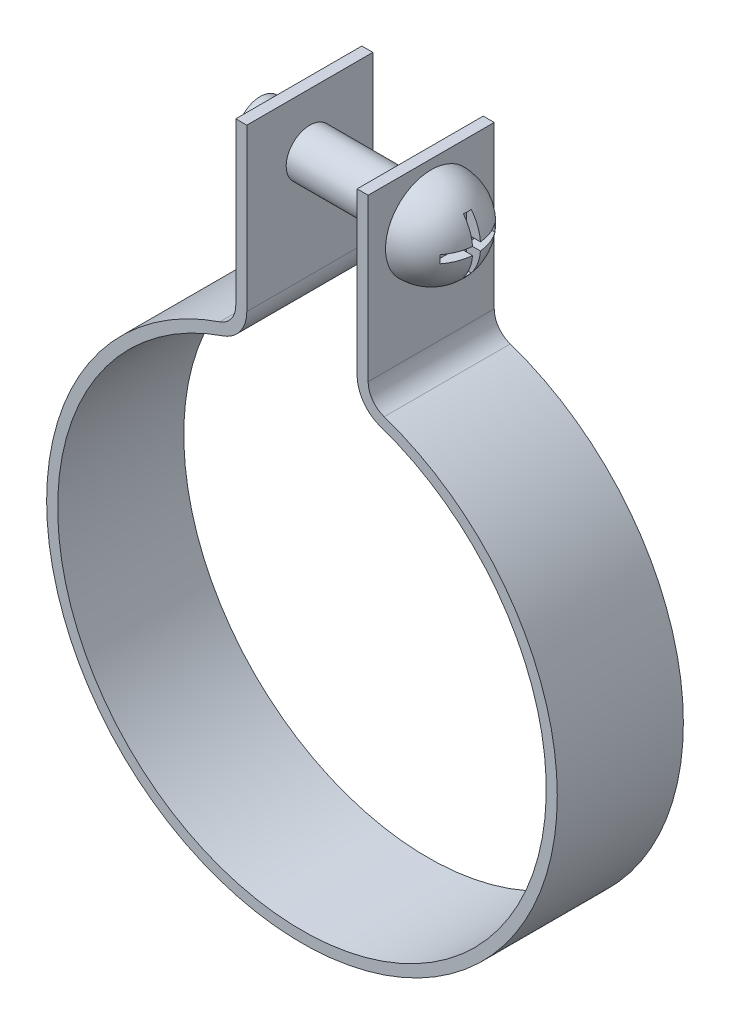
ISO-10303-21;
HEADER;
FILE_DESCRIPTION(('STEP AP214'),'2;1');
FILE_NAME('part.step','',(''),(''),'','','');
FILE_SCHEMA(('AUTOMOTIVE_DESIGN { 1 0 10303 214 1 1 1 1 }'));
ENDSEC;
DATA;
#1=APPLICATION_CONTEXT('core data for automotive mechanical design processes');
#2=APPLICATION_PROTOCOL_DEFINITION('international standard','automotive_design',2000,#1);
#3=PRODUCT_CONTEXT('',#1,'mechanical');
#4=PRODUCT('Part','Part','',(#3));
#5=PRODUCT_RELATED_PRODUCT_CATEGORY('part','',(#4));
#6=PRODUCT_DEFINITION_FORMATION('','',#4);
#7=PRODUCT_DEFINITION_CONTEXT('part definition',#1,'design');
#8=PRODUCT_DEFINITION('design','',#6,#7);
#9=PRODUCT_DEFINITION_SHAPE('','',#8);
#10=(LENGTH_UNIT() NAMED_UNIT(*) SI_UNIT(.MILLI.,.METRE.));
#11=(NAMED_UNIT(*) PLANE_ANGLE_UNIT() SI_UNIT($,.RADIAN.));
#12=(NAMED_UNIT(*) SI_UNIT($,.STERADIAN.) SOLID_ANGLE_UNIT());
#13=UNCERTAINTY_MEASURE_WITH_UNIT(LENGTH_MEASURE(1.E-05),#10,'distance_accuracy_value','');
#14=(GEOMETRIC_REPRESENTATION_CONTEXT(3) GLOBAL_UNCERTAINTY_ASSIGNED_CONTEXT((#13)) GLOBAL_UNIT_ASSIGNED_CONTEXT((#10,
#11,#12)) REPRESENTATION_CONTEXT('',''));
#15=CARTESIAN_POINT('',(0.,0.,0.));
#16=DIRECTION('',(0.,0.,1.));
#17=DIRECTION('',(1.,0.,0.));
#18=AXIS2_PLACEMENT_3D('',#15,#16,#17);
#19=CARTESIAN_POINT('',(-6.65,23.5,0.));
#20=DIRECTION('',(1.,0.,0.));
#21=DIRECTION('',(0.,1.,0.));
#22=AXIS2_PLACEMENT_3D('',#19,#20,#21);
#23=PLANE('',#22);
#24=CARTESIAN_POINT('',(-6.65,23.5,0.));
#25=DIRECTION('',(-1.,0.,0.));
#26=DIRECTION('',(0.,-1.,0.));
#27=AXIS2_PLACEMENT_3D('',#24,#25,#26);
#28=CIRCLE('',#27,1.5);
#29=CARTESIAN_POINT('',(-6.65,22.,0.));
#30=VERTEX_POINT('',#29);
#31=EDGE_CURVE('E17',#30,#30,#28,.F.);
#32=ORIENTED_EDGE('',*,*,#31,.F.);
#33=EDGE_LOOP('',(#32));
#34=FACE_BOUND('',#33,.T.);
#35=ADVANCED_FACE('F14',(#34),#23,.F.);
#36=CARTESIAN_POINT('',(7.09838316997611,23.5,0.));
#37=DIRECTION('',(-1.,0.,0.));
#38=DIRECTION('',(0.,-1.,0.));
#39=AXIS2_PLACEMENT_3D('',#36,#37,#38);
#40=CYLINDRICAL_SURFACE('',#39,1.5);
#41=ORIENTED_EDGE('',*,*,#31,.T.);
#42=EDGE_LOOP('',(#41));
#43=FACE_BOUND('',#42,.T.);
#44=CARTESIAN_POINT('',(-4.65,23.5,0.));
#45=DIRECTION('',(-1.,0.,0.));
#46=DIRECTION('',(0.,-1.,0.));
#47=AXIS2_PLACEMENT_3D('',#44,#45,#46);
#48=CIRCLE('',#47,1.5);
#49=CARTESIAN_POINT('',(-4.65,22.,0.));
#50=VERTEX_POINT('',#49);
#51=EDGE_CURVE('E512',#50,#50,#48,.T.);
#52=ORIENTED_EDGE('',*,*,#51,.T.);
#53=EDGE_LOOP('',(#52));
#54=FACE_BOUND('',#53,.T.);
#55=ADVANCED_FACE('F268',(#43,#54),#40,.T.);
#56=CARTESIAN_POINT('',(6.2,23.25,1.75));
#57=DIRECTION('',(1.,0.,0.));
#58=DIRECTION('',(0.,0.,-1.));
#59=AXIS2_PLACEMENT_3D('',#56,#57,#58);
#60=PLANE('',#59);
#61=DIRECTION('',(0.,1.,0.));
#62=VECTOR('',#61,1.);
#63=CARTESIAN_POINT('',(6.2,25.25,0.25));
#64=LINE('',#63,#62);
#65=CARTESIAN_POINT('',(6.2,23.75,0.25));
#66=VERTEX_POINT('',#65);
#67=CARTESIAN_POINT('',(6.2,25.25,0.25));
#68=VERTEX_POINT('',#67);
#69=EDGE_CURVE('E456',#66,#68,#64,.T.);
#70=ORIENTED_EDGE('',*,*,#69,.F.);
#71=DIRECTION('',(0.,0.,-1.));
#72=VECTOR('',#71,1.);
#73=CARTESIAN_POINT('',(6.2,23.75,0.25));
#74=LINE('',#73,#72);
#75=CARTESIAN_POINT('',(6.2,23.75,1.75));
#76=VERTEX_POINT('',#75);
#77=EDGE_CURVE('E462',#76,#66,#74,.T.);
#78=ORIENTED_EDGE('',*,*,#77,.F.);
#79=DIRECTION('',(0.,1.,0.));
#80=VECTOR('',#79,1.);
#81=CARTESIAN_POINT('',(6.2,23.75,1.75));
#82=LINE('',#81,#80);
#83=CARTESIAN_POINT('',(6.2,23.25,1.75));
#84=VERTEX_POINT('',#83);
#85=EDGE_CURVE('E468',#84,#76,#82,.T.);
#86=ORIENTED_EDGE('',*,*,#85,.F.);
#87=DIRECTION('',(0.,0.,1.));
#88=VECTOR('',#87,1.);
#89=CARTESIAN_POINT('',(6.2,23.25,1.75));
#90=LINE('',#89,#88);
#91=CARTESIAN_POINT('',(6.2,23.25,0.25));
#92=VERTEX_POINT('',#91);
#93=EDGE_CURVE('E474',#92,#84,#90,.T.);
#94=ORIENTED_EDGE('',*,*,#93,.F.);
#95=DIRECTION('',(0.,1.,0.));
#96=VECTOR('',#95,1.);
#97=CARTESIAN_POINT('',(6.2,23.25,0.25));
#98=LINE('',#97,#96);
#99=CARTESIAN_POINT('',(6.2,21.75,0.25));
#100=VERTEX_POINT('',#99);
#101=EDGE_CURVE('E480',#100,#92,#98,.T.);
#102=ORIENTED_EDGE('',*,*,#101,.F.);
#103=DIRECTION('',(0.,0.,1.));
#104=VECTOR('',#103,1.);
#105=CARTESIAN_POINT('',(6.2,21.75,0.25));
#106=LINE('',#105,#104);
#107=CARTESIAN_POINT('',(6.2,21.75,-0.25));
#108=VERTEX_POINT('',#107);
#109=EDGE_CURVE('E204',#108,#100,#106,.T.);
#110=ORIENTED_EDGE('',*,*,#109,.F.);
#111=DIRECTION('',(0.,-1.,0.));
#112=VECTOR('',#111,1.);
#113=CARTESIAN_POINT('',(6.2,21.75,-0.25));
#114=LINE('',#113,#112);
#115=CARTESIAN_POINT('',(6.2,23.25,-0.25));
#116=VERTEX_POINT('',#115);
#117=EDGE_CURVE('E202',#116,#108,#114,.T.);
#118=ORIENTED_EDGE('',*,*,#117,.F.);
#119=DIRECTION('',(0.,0.,1.));
#120=VECTOR('',#119,1.);
#121=CARTESIAN_POINT('',(6.2,23.25,-0.25));
#122=LINE('',#121,#120);
#123=CARTESIAN_POINT('',(6.2,23.25,-1.75));
#124=VERTEX_POINT('',#123);
#125=EDGE_CURVE('E490',#124,#116,#122,.T.);
#126=ORIENTED_EDGE('',*,*,#125,.F.);
#127=DIRECTION('',(0.,1.,0.));
#128=VECTOR('',#127,1.);
#129=CARTESIAN_POINT('',(6.2,23.25,-1.75));
#130=LINE('',#129,#128);
#131=CARTESIAN_POINT('',(6.2,23.75,-1.75));
#132=VERTEX_POINT('',#131);
#133=EDGE_CURVE('E496',#132,#124,#130,.F.);
#134=ORIENTED_EDGE('',*,*,#133,.F.);
#135=DIRECTION('',(0.,0.,1.));
#136=VECTOR('',#135,1.);
#137=CARTESIAN_POINT('',(6.2,23.75,-1.75));
#138=LINE('',#137,#136);
#139=CARTESIAN_POINT('',(6.2,23.75,-0.25));
#140=VERTEX_POINT('',#139);
#141=EDGE_CURVE('E502',#140,#132,#138,.F.);
#142=ORIENTED_EDGE('',*,*,#141,.F.);
#143=DIRECTION('',(0.,-1.,0.));
#144=VECTOR('',#143,1.);
#145=CARTESIAN_POINT('',(6.2,23.75,-0.25));
#146=LINE('',#145,#144);
#147=CARTESIAN_POINT('',(6.2,25.25,-0.25));
#148=VERTEX_POINT('',#147);
#149=EDGE_CURVE('E508',#148,#140,#146,.T.);
#150=ORIENTED_EDGE('',*,*,#149,.F.);
#151=DIRECTION('',(0.,0.,-1.));
#152=VECTOR('',#151,1.);
#153=CARTESIAN_POINT('',(6.2,25.25,1.75));
#154=LINE('',#153,#152);
#155=EDGE_CURVE('E519',#148,#68,#154,.F.);
#156=ORIENTED_EDGE('',*,*,#155,.T.);
#157=EDGE_LOOP('',(#70,#78,#86,#94,#102,#110,#118,#126,#134,#142,#150,#156));
#158=FACE_BOUND('',#157,.T.);
#159=ADVANCED_FACE('F265',(#158),#60,.T.);
#160=CARTESIAN_POINT('',(-4.65,25.,0.));
#161=DIRECTION('',(1.,0.,0.));
#162=DIRECTION('',(0.,1.,0.));
#163=AXIS2_PLACEMENT_3D('',#160,#161,#162);
#164=PLANE('',#163);
#165=CARTESIAN_POINT('',(-4.65,23.5,0.));
#166=DIRECTION('',(-1.,0.,0.));
#167=DIRECTION('',(0.,-1.,0.));
#168=AXIS2_PLACEMENT_3D('',#165,#166,#167);
#169=CIRCLE('',#168,2.);
#170=CARTESIAN_POINT('',(-4.65,21.5,0.));
#171=VERTEX_POINT('',#170);
#172=EDGE_CURVE('E256',#171,#171,#169,.F.);
#173=ORIENTED_EDGE('',*,*,#172,.F.);
#174=EDGE_LOOP('',(#173));
#175=FACE_BOUND('',#174,.T.);
#176=ORIENTED_EDGE('',*,*,#51,.F.);
#177=EDGE_LOOP('',(#176));
#178=FACE_BOUND('',#177,.T.);
#179=ADVANCED_FACE('F261',(#175,#178),#164,.F.);
#180=CARTESIAN_POINT('',(16.2,23.75,-0.25));
#181=DIRECTION('',(0.,0.,1.));
#182=DIRECTION('',(0.,-1.,0.));
#183=AXIS2_PLACEMENT_3D('',#180,#181,#182);
#184=PLANE('',#183);
#185=ORIENTED_EDGE('',*,*,#149,.T.);
#186=DIRECTION('',(1.,0.,0.));
#187=VECTOR('',#186,1.);
#188=CARTESIAN_POINT('',(16.2,23.75,-0.25));
#189=LINE('',#188,#187);
#190=CARTESIAN_POINT('',(7.07673860473988,23.75,-0.25));
#191=VERTEX_POINT('',#190);
#192=EDGE_CURVE('E505',#191,#140,#189,.F.);
#193=ORIENTED_EDGE('',*,*,#192,.F.);
#194=CARTESIAN_POINT('',(6.49687287414885,25.25,-0.25));
#195=CARTESIAN_POINT('',(6.54665375463442,25.1846773678993,-0.25));
#196=CARTESIAN_POINT('',(6.59363284839111,25.1172215093846,-0.25));
#197=CARTESIAN_POINT('',(6.68168682515345,24.9785430288544,-0.25));
#198=CARTESIAN_POINT('',(6.72276063640672,24.9073197262843,-0.25));
#199=CARTESIAN_POINT('',(6.79780589258358,24.7633172653865,-0.25));
#200=CARTESIAN_POINT('',(6.8319198026339,24.690612349176,-0.250000000000001));
#201=CARTESIAN_POINT('',(6.89396672840313,24.5426437169833,-0.249999999999999));
#202=CARTESIAN_POINT('',(6.9219016093801,24.4673807811246,-0.249999999999996));
#203=CARTESIAN_POINT('',(6.98009469113532,24.2879880733263,-0.250000000000006));
#204=CARTESIAN_POINT('',(7.00772853149205,24.1829960716417,-0.250000000000025));
#205=CARTESIAN_POINT('',(7.05139681078929,23.9688741603984,-0.249999999999975));
#206=CARTESIAN_POINT('',(7.06723845095502,23.85970491392,-0.249999999999906));
#207=CARTESIAN_POINT('',(7.07673860473984,23.7500000000007,-0.249999999999732));
#208=B_SPLINE_CURVE_WITH_KNOTS('',3,(#194,#195,#196,#197,#198,#199,#200,#201,#202,#203,#204,
#205,#206,#207),.UNSPECIFIED.,.F.,.F.,(4,2,2,2,2,2,4),(0.,0.246310540780081,0.492665728292477,
0.733315058497538,0.973891644659722,1.29888612081365,1.62908399931379),.UNSPECIFIED.);
#209=CARTESIAN_POINT('',(6.49687287414885,25.25,-0.25));
#210=VERTEX_POINT('',#209);
#211=EDGE_CURVE('E250',#210,#191,#208,.T.);
#212=ORIENTED_EDGE('',*,*,#211,.F.);
#213=DIRECTION('',(1.,0.,0.));
#214=VECTOR('',#213,1.);
#215=CARTESIAN_POINT('',(16.2,25.25,-0.25));
#216=LINE('',#215,#214);
#217=EDGE_CURVE('E449',#148,#210,#216,.T.);
#218=ORIENTED_EDGE('',*,*,#217,.F.);
#219=EDGE_LOOP('',(#185,#193,#212,#218));
#220=FACE_BOUND('',#219,.T.);
#221=ADVANCED_FACE('F257',(#220),#184,.T.);
#222=CARTESIAN_POINT('',(16.2,23.75,-1.75));
#223=DIRECTION('',(0.,-1.,0.));
#224=DIRECTION('',(1.,0.,0.));
#225=AXIS2_PLACEMENT_3D('',#222,#223,#224);
#226=PLANE('',#225);
#227=ORIENTED_EDGE('',*,*,#141,.T.);
#228=DIRECTION('',(1.,0.,0.));
#229=VECTOR('',#228,1.);
#230=CARTESIAN_POINT('',(16.2,23.75,-1.75));
#231=LINE('',#230,#229);
#232=CARTESIAN_POINT('',(6.49687287414884,23.75,-1.75));
#233=VERTEX_POINT('',#232);
#234=EDGE_CURVE('E499',#233,#132,#231,.F.);
#235=ORIENTED_EDGE('',*,*,#234,.F.);
#236=CARTESIAN_POINT('',(4.2,23.75,0.));
#237=DIRECTION('',(0.,1.,0.));
#238=DIRECTION('',(-1.,0.,0.));
#239=AXIS2_PLACEMENT_3D('',#236,#237,#238);
#240=CIRCLE('',#239,2.88758116769049);
#241=EDGE_CURVE('E247',#191,#233,#240,.T.);
#242=ORIENTED_EDGE('',*,*,#241,.F.);
#243=ORIENTED_EDGE('',*,*,#192,.T.);
#244=EDGE_LOOP('',(#227,#235,#242,#243));
#245=FACE_BOUND('',#244,.T.);
#246=ADVANCED_FACE('F239',(#245),#226,.T.);
#247=CARTESIAN_POINT('',(16.2,23.25,-1.75));
#248=DIRECTION('',(0.,0.,1.));
#249=DIRECTION('',(1.,0.,0.));
#250=AXIS2_PLACEMENT_3D('',#247,#248,#249);
#251=PLANE('',#250);
#252=ORIENTED_EDGE('',*,*,#133,.T.);
#253=DIRECTION('',(-1.,0.,0.));
#254=VECTOR('',#253,1.);
#255=CARTESIAN_POINT('',(16.2,23.25,-1.75));
#256=LINE('',#255,#254);
#257=CARTESIAN_POINT('',(6.49687287414884,23.25,-1.75));
#258=VERTEX_POINT('',#257);
#259=EDGE_CURVE('E493',#258,#124,#256,.T.);
#260=ORIENTED_EDGE('',*,*,#259,.F.);
#261=CARTESIAN_POINT('',(6.49687287414884,23.75,-1.75));
#262=CARTESIAN_POINT('',(6.5059164714693,23.6666666666667,-1.75));
#263=CARTESIAN_POINT('',(6.51043827012952,23.5833333333333,-1.75));
#264=CARTESIAN_POINT('',(6.51043827012952,23.4166666666667,-1.75));
#265=CARTESIAN_POINT('',(6.5059164714693,23.3333333333333,-1.75));
#266=CARTESIAN_POINT('',(6.49687287414884,23.25,-1.75));
#267=B_SPLINE_CURVE_WITH_KNOTS('',3,(#261,#262,#263,#264,#265,#266),.UNSPECIFIED.,.F.,.F.,(4,2,
4),(0.,0.250367769427525,0.500735538855047),.UNSPECIFIED.);
#268=EDGE_CURVE('E212',#233,#258,#267,.T.);
#269=ORIENTED_EDGE('',*,*,#268,.F.);
#270=ORIENTED_EDGE('',*,*,#234,.T.);
#271=EDGE_LOOP('',(#252,#260,#269,#270));
#272=FACE_BOUND('',#271,.T.);
#273=ADVANCED_FACE('F234',(#272),#251,.T.);
#274=CARTESIAN_POINT('',(16.2,23.25,-0.25));
#275=DIRECTION('',(0.,1.,0.));
#276=DIRECTION('',(-1.,0.,0.));
#277=AXIS2_PLACEMENT_3D('',#274,#275,#276);
#278=PLANE('',#277);
#279=ORIENTED_EDGE('',*,*,#125,.T.);
#280=DIRECTION('',(1.,0.,0.));
#281=VECTOR('',#280,1.);
#282=CARTESIAN_POINT('',(16.2,23.25,-0.25));
#283=LINE('',#282,#281);
#284=CARTESIAN_POINT('',(7.07673860473988,23.25,-0.25));
#285=VERTEX_POINT('',#284);
#286=EDGE_CURVE('E488',#285,#116,#283,.F.);
#287=ORIENTED_EDGE('',*,*,#286,.F.);
#288=CARTESIAN_POINT('',(4.2,23.25,0.));
#289=DIRECTION('',(0.,1.,0.));
#290=DIRECTION('',(-1.,0.,0.));
#291=AXIS2_PLACEMENT_3D('',#288,#289,#290);
#292=CIRCLE('',#291,2.88758116769049);
#293=EDGE_CURVE('E210',#258,#285,#292,.F.);
#294=ORIENTED_EDGE('',*,*,#293,.F.);
#295=ORIENTED_EDGE('',*,*,#259,.T.);
#296=EDGE_LOOP('',(#279,#287,#294,#295));
#297=FACE_BOUND('',#296,.T.);
#298=ADVANCED_FACE('F230',(#297),#278,.T.);
#299=CARTESIAN_POINT('',(16.2,21.75,-0.25));
#300=DIRECTION('',(0.,0.,1.));
#301=DIRECTION('',(0.,-1.,0.));
#302=AXIS2_PLACEMENT_3D('',#299,#300,#301);
#303=PLANE('',#302);
#304=ORIENTED_EDGE('',*,*,#117,.T.);
#305=DIRECTION('',(-1.,0.,0.));
#306=VECTOR('',#305,1.);
#307=CARTESIAN_POINT('',(16.2,21.75,-0.25));
#308=LINE('',#307,#306);
#309=CARTESIAN_POINT('',(6.49687287414885,21.75,-0.25));
#310=VERTEX_POINT('',#309);
#311=EDGE_CURVE('E187',#310,#108,#308,.T.);
#312=ORIENTED_EDGE('',*,*,#311,.F.);
#313=CARTESIAN_POINT('',(7.07673860473988,23.25,-0.25));
#314=CARTESIAN_POINT('',(7.06963694689979,23.1681785554857,-0.25));
#315=CARTESIAN_POINT('',(7.05902715557849,23.0866631555525,-0.25));
#316=CARTESIAN_POINT('',(7.03090495022989,22.9248164214113,-0.25));
#317=CARTESIAN_POINT('',(7.01339128536824,22.8444853045078,-0.25));
#318=CARTESIAN_POINT('',(6.9720618608212,22.687449073383,-0.25));
#319=CARTESIAN_POINT('',(6.94840145955926,22.6107030694985,-0.25));
#320=CARTESIAN_POINT('',(6.89478581354943,22.4594750971742,-0.25));
#321=CARTESIAN_POINT('',(6.86483247378351,22.384992451369,-0.25));
#322=CARTESIAN_POINT('',(6.78722816182028,22.2131036816948,-0.25));
#323=CARTESIAN_POINT('',(6.73705526339339,22.1168247649266,-0.25));
#324=CARTESIAN_POINT('',(6.62534290140629,21.9290071414972,-0.25));
#325=CARTESIAN_POINT('',(6.56363431222961,21.8375690096175,-0.25));
#326=CARTESIAN_POINT('',(6.49687287414885,21.75,-0.25));
#327=B_SPLINE_CURVE_WITH_KNOTS('',3,(#313,#314,#315,#316,#317,#318,#319,#320,#321,#322,#323,
#324,#325,#326),.UNSPECIFIED.,.F.,.F.,(4,2,2,2,2,2,4),(0.,0.246310540780083,0.492665728292481,
0.733315058497539,0.973891644659718,1.298886120814,1.6290839993145),.UNSPECIFIED.);
#328=EDGE_CURVE('E194',#285,#310,#327,.T.);
#329=ORIENTED_EDGE('',*,*,#328,.F.);
#330=ORIENTED_EDGE('',*,*,#286,.T.);
#331=EDGE_LOOP('',(#304,#312,#329,#330));
#332=FACE_BOUND('',#331,.T.);
#333=ADVANCED_FACE('F198',(#332),#303,.T.);
#334=CARTESIAN_POINT('',(16.2,21.75,0.25));
#335=DIRECTION('',(0.,1.,0.));
#336=DIRECTION('',(-1.,0.,0.));
#337=AXIS2_PLACEMENT_3D('',#334,#335,#336);
#338=PLANE('',#337);
#339=ORIENTED_EDGE('',*,*,#109,.T.);
#340=DIRECTION('',(1.,0.,0.));
#341=VECTOR('',#340,1.);
#342=CARTESIAN_POINT('',(16.2,21.75,0.25));
#343=LINE('',#342,#341);
#344=CARTESIAN_POINT('',(6.49687287414885,21.75,0.25));
#345=VERTEX_POINT('',#344);
#346=EDGE_CURVE('E189',#345,#100,#343,.F.);
#347=ORIENTED_EDGE('',*,*,#346,.F.);
#348=CARTESIAN_POINT('',(4.2,21.75,0.));
#349=DIRECTION('',(0.,1.,0.));
#350=DIRECTION('',(-1.,0.,0.));
#351=AXIS2_PLACEMENT_3D('',#348,#349,#350);
#352=CIRCLE('',#351,2.31043827011257);
#353=EDGE_CURVE('E184',#310,#345,#352,.F.);
#354=ORIENTED_EDGE('',*,*,#353,.F.);
#355=ORIENTED_EDGE('',*,*,#311,.T.);
#356=EDGE_LOOP('',(#339,#347,#354,#355));
#357=FACE_BOUND('',#356,.T.);
#358=ADVANCED_FACE('F186',(#357),#338,.T.);
#359=CARTESIAN_POINT('',(16.2,23.25,0.25));
#360=DIRECTION('',(0.,0.,-1.));
#361=DIRECTION('',(0.,1.,0.));
#362=AXIS2_PLACEMENT_3D('',#359,#360,#361);
#363=PLANE('',#362);
#364=ORIENTED_EDGE('',*,*,#101,.T.);
#365=DIRECTION('',(-1.,0.,0.));
#366=VECTOR('',#365,1.);
#367=CARTESIAN_POINT('',(16.2,23.25,0.25));
#368=LINE('',#367,#366);
#369=CARTESIAN_POINT('',(7.07673860473988,23.25,0.25));
#370=VERTEX_POINT('',#369);
#371=EDGE_CURVE('E477',#370,#92,#368,.T.);
#372=ORIENTED_EDGE('',*,*,#371,.F.);
#373=CARTESIAN_POINT('',(6.49687287414885,21.75,0.250000000000001));
#374=CARTESIAN_POINT('',(6.54665375463442,21.8153226321007,0.250000000000001));
#375=CARTESIAN_POINT('',(6.59363284839112,21.8827784906154,0.25));
#376=CARTESIAN_POINT('',(6.68168682515345,22.0214569711456,0.25));
#377=CARTESIAN_POINT('',(6.72276063640672,22.0926802737157,0.25));
#378=CARTESIAN_POINT('',(6.79780589258358,22.2366827346135,0.25));
#379=CARTESIAN_POINT('',(6.8319198026339,22.309387650824,0.250000000000001));
#380=CARTESIAN_POINT('',(6.89396672840313,22.4573562830167,0.249999999999999));
#381=CARTESIAN_POINT('',(6.9219016093801,22.5326192188754,0.249999999999995));
#382=CARTESIAN_POINT('',(6.98009469113532,22.7120119266737,0.250000000000005));
#383=CARTESIAN_POINT('',(7.00772853149205,22.8170039283583,0.250000000000024));
#384=CARTESIAN_POINT('',(7.05139681078929,23.0311258396016,0.249999999999976));
#385=CARTESIAN_POINT('',(7.06723845095502,23.14029508608,0.249999999999907));
#386=CARTESIAN_POINT('',(7.07673860473984,23.2499999999993,0.249999999999733));
#387=B_SPLINE_CURVE_WITH_KNOTS('',3,(#373,#374,#375,#376,#377,#378,#379,#380,#381,#382,#383,
#384,#385,#386),.UNSPECIFIED.,.F.,.F.,(4,2,2,2,2,2,4),(0.,0.246310540780082,0.492665728292477,
0.733315058497538,0.973891644659722,1.29888612081365,1.62908399931379),.UNSPECIFIED.);
#388=EDGE_CURVE('E193',#345,#370,#387,.T.);
#389=ORIENTED_EDGE('',*,*,#388,.F.);
#390=ORIENTED_EDGE('',*,*,#346,.T.);
#391=EDGE_LOOP('',(#364,#372,#389,#390));
#392=FACE_BOUND('',#391,.T.);
#393=ADVANCED_FACE('F615',(#392),#363,.T.);
#394=CARTESIAN_POINT('',(16.2,23.25,1.75));
#395=DIRECTION('',(0.,1.,0.));
#396=DIRECTION('',(-1.,0.,0.));
#397=AXIS2_PLACEMENT_3D('',#394,#395,#396);
#398=PLANE('',#397);
#399=ORIENTED_EDGE('',*,*,#93,.T.);
#400=DIRECTION('',(-1.,0.,0.));
#401=VECTOR('',#400,1.);
#402=CARTESIAN_POINT('',(16.2,23.25,1.75));
#403=LINE('',#402,#401);
#404=CARTESIAN_POINT('',(6.49687287414884,23.25,1.75));
#405=VERTEX_POINT('',#404);
#406=EDGE_CURVE('E471',#405,#84,#403,.T.);
#407=ORIENTED_EDGE('',*,*,#406,.F.);
#408=CARTESIAN_POINT('',(4.2,23.25,0.));
#409=DIRECTION('',(0.,1.,0.));
#410=DIRECTION('',(-1.,0.,0.));
#411=AXIS2_PLACEMENT_3D('',#408,#409,#410);
#412=CIRCLE('',#411,2.88758116769049);
#413=EDGE_CURVE('E609',#370,#405,#412,.F.);
#414=ORIENTED_EDGE('',*,*,#413,.F.);
#415=ORIENTED_EDGE('',*,*,#371,.T.);
#416=EDGE_LOOP('',(#399,#407,#414,#415));
#417=FACE_BOUND('',#416,.T.);
#418=ADVANCED_FACE('F600',(#417),#398,.T.);
#419=CARTESIAN_POINT('',(16.2,23.75,1.75));
#420=DIRECTION('',(0.,0.,-1.));
#421=DIRECTION('',(-1.,0.,0.));
#422=AXIS2_PLACEMENT_3D('',#419,#420,#421);
#423=PLANE('',#422);
#424=ORIENTED_EDGE('',*,*,#85,.T.);
#425=DIRECTION('',(1.,0.,0.));
#426=VECTOR('',#425,1.);
#427=CARTESIAN_POINT('',(16.2,23.75,1.75));
#428=LINE('',#427,#426);
#429=CARTESIAN_POINT('',(6.49687287414884,23.75,1.75));
#430=VERTEX_POINT('',#429);
#431=EDGE_CURVE('E465',#430,#76,#428,.F.);
#432=ORIENTED_EDGE('',*,*,#431,.F.);
#433=CARTESIAN_POINT('',(6.49687287414884,23.25,1.75));
#434=CARTESIAN_POINT('',(6.5059164714693,23.3333333333333,1.75));
#435=CARTESIAN_POINT('',(6.51043827012952,23.4166666666667,1.75));
#436=CARTESIAN_POINT('',(6.51043827012952,23.5833333333333,1.75));
#437=CARTESIAN_POINT('',(6.5059164714693,23.6666666666667,1.75));
#438=CARTESIAN_POINT('',(6.49687287414884,23.75,1.75));
#439=B_SPLINE_CURVE_WITH_KNOTS('',3,(#433,#434,#435,#436,#437,#438),.UNSPECIFIED.,.F.,.F.,(4,2,
4),(0.,0.250367769427525,0.500735538855047),.UNSPECIFIED.);
#440=EDGE_CURVE('E602',#405,#430,#439,.T.);
#441=ORIENTED_EDGE('',*,*,#440,.F.);
#442=ORIENTED_EDGE('',*,*,#406,.T.);
#443=EDGE_LOOP('',(#424,#432,#441,#442));
#444=FACE_BOUND('',#443,.T.);
#445=ADVANCED_FACE('F595',(#444),#423,.T.);
#446=CARTESIAN_POINT('',(16.2,23.75,0.25));
#447=DIRECTION('',(0.,-1.,0.));
#448=DIRECTION('',(0.,0.,-1.));
#449=AXIS2_PLACEMENT_3D('',#446,#447,#448);
#450=PLANE('',#449);
#451=ORIENTED_EDGE('',*,*,#77,.T.);
#452=DIRECTION('',(-1.,0.,0.));
#453=VECTOR('',#452,1.);
#454=CARTESIAN_POINT('',(16.2,23.75,0.25));
#455=LINE('',#454,#453);
#456=CARTESIAN_POINT('',(7.07673860473988,23.75,0.25));
#457=VERTEX_POINT('',#456);
#458=EDGE_CURVE('E459',#457,#66,#455,.T.);
#459=ORIENTED_EDGE('',*,*,#458,.F.);
#460=CARTESIAN_POINT('',(4.2,23.75,0.));
#461=DIRECTION('',(0.,1.,0.));
#462=DIRECTION('',(-1.,0.,0.));
#463=AXIS2_PLACEMENT_3D('',#460,#461,#462);
#464=CIRCLE('',#463,2.88758116769049);
#465=EDGE_CURVE('E582',#430,#457,#464,.T.);
#466=ORIENTED_EDGE('',*,*,#465,.F.);
#467=ORIENTED_EDGE('',*,*,#431,.T.);
#468=EDGE_LOOP('',(#451,#459,#466,#467));
#469=FACE_BOUND('',#468,.T.);
#470=ADVANCED_FACE('F590',(#469),#450,.T.);
#471=CARTESIAN_POINT('',(16.2,25.25,0.25));
#472=DIRECTION('',(0.,0.,-1.));
#473=DIRECTION('',(-1.,0.,0.));
#474=AXIS2_PLACEMENT_3D('',#471,#472,#473);
#475=PLANE('',#474);
#476=ORIENTED_EDGE('',*,*,#69,.T.);
#477=DIRECTION('',(1.,0.,0.));
#478=VECTOR('',#477,1.);
#479=CARTESIAN_POINT('',(16.2,25.25,0.25));
#480=LINE('',#479,#478);
#481=CARTESIAN_POINT('',(6.49687287414885,25.25,0.25));
#482=VERTEX_POINT('',#481);
#483=EDGE_CURVE('E451',#482,#68,#480,.F.);
#484=ORIENTED_EDGE('',*,*,#483,.F.);
#485=CARTESIAN_POINT('',(7.07673860473988,23.75,0.249999999999998));
#486=CARTESIAN_POINT('',(7.06963694689979,23.8318214445143,0.249999999999999));
#487=CARTESIAN_POINT('',(7.05902715557849,23.9133368444475,0.25));
#488=CARTESIAN_POINT('',(7.03090495022989,24.0751835785887,0.25));
#489=CARTESIAN_POINT('',(7.01339128536824,24.1555146954922,0.25));
#490=CARTESIAN_POINT('',(6.9720618608212,24.312550926617,0.25));
#491=CARTESIAN_POINT('',(6.94840145955926,24.3892969305015,0.25));
#492=CARTESIAN_POINT('',(6.89478581354943,24.5405249028258,0.25));
#493=CARTESIAN_POINT('',(6.86483247378351,24.615007548631,0.25));
#494=CARTESIAN_POINT('',(6.78722816182028,24.7868963183052,0.250000000000001));
#495=CARTESIAN_POINT('',(6.73705526339339,24.8831752350734,0.25));
#496=CARTESIAN_POINT('',(6.62534290140629,25.0709928585028,0.25));
#497=CARTESIAN_POINT('',(6.56363431222961,25.1624309903825,0.249999999999999));
#498=CARTESIAN_POINT('',(6.49687287414885,25.25,0.249999999999999));
#499=B_SPLINE_CURVE_WITH_KNOTS('',3,(#485,#486,#487,#488,#489,#490,#491,#492,#493,#494,#495,
#496,#497,#498),.UNSPECIFIED.,.F.,.F.,(4,2,2,2,2,2,4),(0.,0.24631054078008,0.492665728292481,
0.733315058497539,0.973891644659718,1.298886120814,1.6290839993145),.UNSPECIFIED.);
#500=EDGE_CURVE('E575',#457,#482,#499,.T.);
#501=ORIENTED_EDGE('',*,*,#500,.F.);
#502=ORIENTED_EDGE('',*,*,#458,.T.);
#503=EDGE_LOOP('',(#476,#484,#501,#502));
#504=FACE_BOUND('',#503,.T.);
#505=ADVANCED_FACE('F584',(#504),#475,.T.);
#506=CARTESIAN_POINT('',(16.2,25.25,-0.25));
#507=DIRECTION('',(0.,-1.,0.));
#508=DIRECTION('',(1.,0.,0.));
#509=AXIS2_PLACEMENT_3D('',#506,#507,#508);
#510=PLANE('',#509);
#511=ORIENTED_EDGE('',*,*,#155,.F.);
#512=ORIENTED_EDGE('',*,*,#217,.T.);
#513=CARTESIAN_POINT('',(4.2,25.25,0.));
#514=DIRECTION('',(0.,1.,0.));
#515=DIRECTION('',(-1.,0.,0.));
#516=AXIS2_PLACEMENT_3D('',#513,#514,#515);
#517=CIRCLE('',#516,2.31043827011258);
#518=EDGE_CURVE('E178',#482,#210,#517,.T.);
#519=ORIENTED_EDGE('',*,*,#518,.F.);
#520=ORIENTED_EDGE('',*,*,#483,.T.);
#521=EDGE_LOOP('',(#511,#512,#519,#520));
#522=FACE_BOUND('',#521,.T.);
#523=ADVANCED_FACE('F589',(#522),#510,.T.);
#524=CARTESIAN_POINT('',(7.09838316997611,23.5,0.));
#525=DIRECTION('',(-1.,0.,0.));
#526=DIRECTION('',(0.,-1.,0.));
#527=AXIS2_PLACEMENT_3D('',#524,#525,#526);
#528=CYLINDRICAL_SURFACE('',#527,2.);
#529=ORIENTED_EDGE('',*,*,#172,.T.);
#530=EDGE_LOOP('',(#529));
#531=FACE_BOUND('',#530,.T.);
#532=CARTESIAN_POINT('',(-4.2,23.5,0.));
#533=DIRECTION('',(-1.,0.,0.));
#534=DIRECTION('',(0.,-1.,0.));
#535=AXIS2_PLACEMENT_3D('',#532,#533,#534);
#536=CIRCLE('',#535,2.);
#537=CARTESIAN_POINT('',(-4.2,21.5,0.));
#538=VERTEX_POINT('',#537);
#539=EDGE_CURVE('E419',#538,#538,#536,.T.);
#540=ORIENTED_EDGE('',*,*,#539,.T.);
#541=EDGE_LOOP('',(#540));
#542=FACE_BOUND('',#541,.T.);
#543=ADVANCED_FACE('F707',(#531,#542),#528,.T.);
#544=CARTESIAN_POINT('',(-3.5,27.,4.));
#545=DIRECTION('',(0.,-1.,0.));
#546=DIRECTION('',(0.,0.,-1.));
#547=AXIS2_PLACEMENT_3D('',#544,#545,#546);
#548=PLANE('',#547);
#549=DIRECTION('',(1.,0.,0.));
#550=VECTOR('',#549,1.);
#551=CARTESIAN_POINT('',(-3.5,27.,-4.));
#552=LINE('',#551,#550);
#553=CARTESIAN_POINT('',(-4.2,27.,-4.));
#554=VERTEX_POINT('',#553);
#555=CARTESIAN_POINT('',(-3.5,27.,-4.));
#556=VERTEX_POINT('',#555);
#557=EDGE_CURVE('E436',#554,#556,#552,.T.);
#558=ORIENTED_EDGE('',*,*,#557,.F.);
#559=DIRECTION('',(0.,0.,1.));
#560=VECTOR('',#559,1.);
#561=CARTESIAN_POINT('',(-4.2,27.,4.));
#562=LINE('',#561,#560);
#563=CARTESIAN_POINT('',(-4.2,27.,4.));
#564=VERTEX_POINT('',#563);
#565=EDGE_CURVE('E424',#554,#564,#562,.T.);
#566=ORIENTED_EDGE('',*,*,#565,.T.);
#567=DIRECTION('',(1.,0.,0.));
#568=VECTOR('',#567,1.);
#569=CARTESIAN_POINT('',(-3.5,27.,4.));
#570=LINE('',#569,#568);
#571=CARTESIAN_POINT('',(-3.5,27.,4.));
#572=VERTEX_POINT('',#571);
#573=EDGE_CURVE('E442',#572,#564,#570,.F.);
#574=ORIENTED_EDGE('',*,*,#573,.F.);
#575=DIRECTION('',(0.,0.,1.));
#576=VECTOR('',#575,1.);
#577=CARTESIAN_POINT('',(-3.5,27.,4.));
#578=LINE('',#577,#576);
#579=EDGE_CURVE('E416',#572,#556,#578,.F.);
#580=ORIENTED_EDGE('',*,*,#579,.T.);
#581=EDGE_LOOP('',(#558,#566,#574,#580));
#582=FACE_BOUND('',#581,.T.);
#583=ADVANCED_FACE('F715',(#582),#548,.F.);
#584=CARTESIAN_POINT('',(7.09838316997611,23.5,0.));
#585=DIRECTION('',(-1.,0.,0.));
#586=DIRECTION('',(0.,-1.,0.));
#587=AXIS2_PLACEMENT_3D('',#584,#585,#586);
#588=CYLINDRICAL_SURFACE('',#587,1.5);
#589=CARTESIAN_POINT('',(-3.5,23.5,0.));
#590=DIRECTION('',(-1.,0.,0.));
#591=DIRECTION('',(0.,-1.,0.));
#592=AXIS2_PLACEMENT_3D('',#589,#590,#591);
#593=CIRCLE('',#592,1.5);
#594=CARTESIAN_POINT('',(-3.5,22.,0.));
#595=VERTEX_POINT('',#594);
#596=EDGE_CURVE('E415',#595,#595,#593,.F.);
#597=ORIENTED_EDGE('',*,*,#596,.T.);
#598=EDGE_LOOP('',(#597));
#599=FACE_BOUND('',#598,.T.);
#600=CARTESIAN_POINT('',(3.5,23.5,0.));
#601=DIRECTION('',(-1.,0.,0.));
#602=DIRECTION('',(0.,-1.,0.));
#603=AXIS2_PLACEMENT_3D('',#600,#601,#602);
#604=CIRCLE('',#603,1.5);
#605=CARTESIAN_POINT('',(3.5,22.,0.));
#606=VERTEX_POINT('',#605);
#607=EDGE_CURVE('E396',#606,#606,#604,.T.);
#608=ORIENTED_EDGE('',*,*,#607,.T.);
#609=EDGE_LOOP('',(#608));
#610=FACE_BOUND('',#609,.T.);
#611=ADVANCED_FACE('F724',(#599,#610),#588,.T.);
#612=CARTESIAN_POINT('',(4.2,27.,4.));
#613=DIRECTION('',(0.,-1.,0.));
#614=DIRECTION('',(0.,0.,-1.));
#615=AXIS2_PLACEMENT_3D('',#612,#613,#614);
#616=PLANE('',#615);
#617=DIRECTION('',(1.,0.,0.));
#618=VECTOR('',#617,1.);
#619=CARTESIAN_POINT('',(4.2,27.,-4.));
#620=LINE('',#619,#618);
#621=CARTESIAN_POINT('',(3.5,27.,-4.));
#622=VERTEX_POINT('',#621);
#623=CARTESIAN_POINT('',(4.2,27.,-4.));
#624=VERTEX_POINT('',#623);
#625=EDGE_CURVE('E32',#622,#624,#620,.T.);
#626=ORIENTED_EDGE('',*,*,#625,.F.);
#627=DIRECTION('',(0.,0.,-1.));
#628=VECTOR('',#627,1.);
#629=CARTESIAN_POINT('',(3.5,27.,4.));
#630=LINE('',#629,#628);
#631=CARTESIAN_POINT('',(3.5,27.,4.));
#632=VERTEX_POINT('',#631);
#633=EDGE_CURVE('E401',#622,#632,#630,.F.);
#634=ORIENTED_EDGE('',*,*,#633,.T.);
#635=DIRECTION('',(1.,0.,0.));
#636=VECTOR('',#635,1.);
#637=CARTESIAN_POINT('',(4.2,27.,4.));
#638=LINE('',#637,#636);
#639=CARTESIAN_POINT('',(4.2,27.,4.));
#640=VERTEX_POINT('',#639);
#641=EDGE_CURVE('E434',#640,#632,#638,.F.);
#642=ORIENTED_EDGE('',*,*,#641,.F.);
#643=DIRECTION('',(0.,0.,1.));
#644=VECTOR('',#643,1.);
#645=CARTESIAN_POINT('',(4.2,27.,4.));
#646=LINE('',#645,#644);
#647=EDGE_CURVE('E351',#640,#624,#646,.F.);
#648=ORIENTED_EDGE('',*,*,#647,.T.);
#649=EDGE_LOOP('',(#626,#634,#642,#648));
#650=FACE_BOUND('',#649,.T.);
#651=ADVANCED_FACE('F330',(#650),#616,.F.);
#652=CARTESIAN_POINT('',(4.2,23.5,0.));
#653=DIRECTION('',(0.,1.,0.));
#654=DIRECTION('',(1.,0.,0.));
#655=AXIS2_PLACEMENT_3D('',#652,#653,#654);
#656=SPHERICAL_SURFACE('',#655,2.89838316997611);
#657=ORIENTED_EDGE('',*,*,#328,.T.);
#658=ORIENTED_EDGE('',*,*,#353,.T.);
#659=ORIENTED_EDGE('',*,*,#388,.T.);
#660=ORIENTED_EDGE('',*,*,#413,.T.);
#661=ORIENTED_EDGE('',*,*,#440,.T.);
#662=ORIENTED_EDGE('',*,*,#465,.T.);
#663=ORIENTED_EDGE('',*,*,#500,.T.);
#664=ORIENTED_EDGE('',*,*,#518,.T.);
#665=ORIENTED_EDGE('',*,*,#211,.T.);
#666=ORIENTED_EDGE('',*,*,#241,.T.);
#667=ORIENTED_EDGE('',*,*,#268,.T.);
#668=ORIENTED_EDGE('',*,*,#293,.T.);
#669=EDGE_LOOP('',(#657,#658,#659,#660,#661,#662,#663,#664,#665,#666,#667,#668));
#670=FACE_BOUND('',#669,.T.);
#671=CARTESIAN_POINT('',(4.2,23.5,0.));
#672=DIRECTION('',(1.,0.,0.));
#673=DIRECTION('',(0.,1.,0.));
#674=AXIS2_PLACEMENT_3D('',#671,#672,#673);
#675=CIRCLE('',#674,2.89838316997611);
#676=CARTESIAN_POINT('',(4.2,26.3983831699761,0.));
#677=VERTEX_POINT('',#676);
#678=CARTESIAN_POINT('',(4.2,20.6016168300239,0.));
#679=VERTEX_POINT('',#678);
#680=EDGE_CURVE('E431',#677,#679,#675,.T.);
#681=ORIENTED_EDGE('',*,*,#680,.T.);
#682=CARTESIAN_POINT('',(4.2,23.5,0.));
#683=DIRECTION('',(-1.,0.,0.));
#684=DIRECTION('',(0.,1.,0.));
#685=AXIS2_PLACEMENT_3D('',#682,#683,#684);
#686=CIRCLE('',#685,2.89838316997611);
#687=EDGE_CURVE('E350',#679,#677,#686,.F.);
#688=ORIENTED_EDGE('',*,*,#687,.T.);
#689=EDGE_LOOP('',(#681,#688));
#690=FACE_BOUND('',#689,.T.);
#691=ADVANCED_FACE('F206',(#670,#690),#656,.T.);
#692=CARTESIAN_POINT('',(5.7,16.7570880525227,4.));
#693=DIRECTION('',(0.,0.,-1.));
#694=DIRECTION('',(-1.,0.,0.));
#695=AXIS2_PLACEMENT_3D('',#692,#693,#694);
#696=CYLINDRICAL_SURFACE('',#695,1.5);
#697=CARTESIAN_POINT('',(5.7,16.7570880525227,-4.));
#698=DIRECTION('',(0.,0.,-1.));
#699=DIRECTION('',(-1.,0.,0.));
#700=AXIS2_PLACEMENT_3D('',#697,#698,#699);
#701=CIRCLE('',#700,1.5);
#702=CARTESIAN_POINT('',(4.2,16.7570880525227,-4.));
#703=VERTEX_POINT('',#702);
#704=CARTESIAN_POINT('',(5.21694915254237,15.3369958446818,-4.));
#705=VERTEX_POINT('',#704);
#706=EDGE_CURVE('E333',#703,#705,#701,.F.);
#707=ORIENTED_EDGE('',*,*,#706,.F.);
#708=DIRECTION('',(0.,0.,1.));
#709=VECTOR('',#708,1.);
#710=CARTESIAN_POINT('',(4.2,16.7570880525227,4.));
#711=LINE('',#710,#709);
#712=CARTESIAN_POINT('',(4.2,16.7570880525227,4.));
#713=VERTEX_POINT('',#712);
#714=EDGE_CURVE('E336',#703,#713,#711,.T.);
#715=ORIENTED_EDGE('',*,*,#714,.T.);
#716=CARTESIAN_POINT('',(5.7,16.7570880525227,4.));
#717=DIRECTION('',(0.,0.,-1.));
#718=DIRECTION('',(-1.,0.,0.));
#719=AXIS2_PLACEMENT_3D('',#716,#717,#718);
#720=CIRCLE('',#719,1.5);
#721=CARTESIAN_POINT('',(5.21694915254237,15.3369958446818,4.));
#722=VERTEX_POINT('',#721);
#723=EDGE_CURVE('E375',#713,#722,#720,.F.);
#724=ORIENTED_EDGE('',*,*,#723,.T.);
#725=DIRECTION('',(0.,0.,-1.));
#726=VECTOR('',#725,1.);
#727=CARTESIAN_POINT('',(5.21694915254237,15.3369958446818,4.));
#728=LINE('',#727,#726);
#729=EDGE_CURVE('E339',#705,#722,#728,.F.);
#730=ORIENTED_EDGE('',*,*,#729,.F.);
#731=EDGE_LOOP('',(#707,#715,#724,#730));
#732=FACE_BOUND('',#731,.T.);
#733=ADVANCED_FACE('F323',(#732),#696,.F.);
#734=CARTESIAN_POINT('',(-5.7,16.7570880525227,4.));
#735=DIRECTION('',(0.,0.,-1.));
#736=DIRECTION('',(-1.,0.,0.));
#737=AXIS2_PLACEMENT_3D('',#734,#735,#736);
#738=CYLINDRICAL_SURFACE('',#737,1.5);
#739=CARTESIAN_POINT('',(-5.7,16.7570880525227,-4.));
#740=DIRECTION('',(0.,0.,-1.));
#741=DIRECTION('',(-1.,0.,0.));
#742=AXIS2_PLACEMENT_3D('',#739,#740,#741);
#743=CIRCLE('',#742,1.5);
#744=CARTESIAN_POINT('',(-5.21694915254237,15.3369958446818,-4.));
#745=VERTEX_POINT('',#744);
#746=CARTESIAN_POINT('',(-4.2,16.7570880525227,-4.));
#747=VERTEX_POINT('',#746);
#748=EDGE_CURVE('E340',#745,#747,#743,.F.);
#749=ORIENTED_EDGE('',*,*,#748,.F.);
#750=DIRECTION('',(0.,0.,-1.));
#751=VECTOR('',#750,1.);
#752=CARTESIAN_POINT('',(-5.21694915254237,15.3369958446818,4.));
#753=LINE('',#752,#751);
#754=CARTESIAN_POINT('',(-5.21694915254237,15.3369958446818,4.));
#755=VERTEX_POINT('',#754);
#756=EDGE_CURVE('E341',#755,#745,#753,.T.);
#757=ORIENTED_EDGE('',*,*,#756,.F.);
#758=CARTESIAN_POINT('',(-5.7,16.7570880525227,4.));
#759=DIRECTION('',(0.,0.,-1.));
#760=DIRECTION('',(-1.,0.,0.));
#761=AXIS2_PLACEMENT_3D('',#758,#759,#760);
#762=CIRCLE('',#761,1.5);
#763=CARTESIAN_POINT('',(-4.2,16.7570880525227,4.));
#764=VERTEX_POINT('',#763);
#765=EDGE_CURVE('E392',#755,#764,#762,.F.);
#766=ORIENTED_EDGE('',*,*,#765,.T.);
#767=DIRECTION('',(0.,0.,1.));
#768=VECTOR('',#767,1.);
#769=CARTESIAN_POINT('',(-4.2,16.7570880525227,4.));
#770=LINE('',#769,#768);
#771=EDGE_CURVE('E422',#764,#747,#770,.F.);
#772=ORIENTED_EDGE('',*,*,#771,.T.);
#773=EDGE_LOOP('',(#749,#757,#766,#772));
#774=FACE_BOUND('',#773,.T.);
#775=ADVANCED_FACE('F320',(#774),#738,.F.);
#776=CARTESIAN_POINT('',(-4.2,27.,4.));
#777=DIRECTION('',(1.,0.,0.));
#778=DIRECTION('',(0.,1.,0.));
#779=AXIS2_PLACEMENT_3D('',#776,#777,#778);
#780=PLANE('',#779);
#781=ORIENTED_EDGE('',*,*,#539,.F.);
#782=EDGE_LOOP('',(#781));
#783=FACE_BOUND('',#782,.T.);
#784=DIRECTION('',(0.,1.,0.));
#785=VECTOR('',#784,1.);
#786=CARTESIAN_POINT('',(-4.2,16.7570880525227,-4.));
#787=LINE('',#786,#785);
#788=EDGE_CURVE('E367',#747,#554,#787,.T.);
#789=ORIENTED_EDGE('',*,*,#788,.F.);
#790=ORIENTED_EDGE('',*,*,#771,.F.);
#791=DIRECTION('',(0.,1.,0.));
#792=VECTOR('',#791,1.);
#793=CARTESIAN_POINT('',(-4.2,16.7570880525227,4.));
#794=LINE('',#793,#792);
#795=EDGE_CURVE('E387',#764,#564,#794,.T.);
#796=ORIENTED_EDGE('',*,*,#795,.T.);
#797=ORIENTED_EDGE('',*,*,#565,.F.);
#798=EDGE_LOOP('',(#789,#790,#796,#797));
#799=FACE_BOUND('',#798,.T.);
#800=ADVANCED_FACE('F316',(#783,#799),#780,.F.);
#801=CARTESIAN_POINT('',(-3.5,16.7570880525227,4.));
#802=DIRECTION('',(-1.,0.,0.));
#803=DIRECTION('',(0.,0.,1.));
#804=AXIS2_PLACEMENT_3D('',#801,#802,#803);
#805=PLANE('',#804);
#806=ORIENTED_EDGE('',*,*,#596,.F.);
#807=EDGE_LOOP('',(#806));
#808=FACE_BOUND('',#807,.T.);
#809=DIRECTION('',(0.,1.,0.));
#810=VECTOR('',#809,1.);
#811=CARTESIAN_POINT('',(-3.5,16.7570880525227,-4.));
#812=LINE('',#811,#810);
#813=CARTESIAN_POINT('',(-3.5,16.7570880525227,-4.));
#814=VERTEX_POINT('',#813);
#815=EDGE_CURVE('E363',#556,#814,#812,.F.);
#816=ORIENTED_EDGE('',*,*,#815,.F.);
#817=ORIENTED_EDGE('',*,*,#579,.F.);
#818=DIRECTION('',(0.,1.,0.));
#819=VECTOR('',#818,1.);
#820=CARTESIAN_POINT('',(-3.5,16.7570880525227,4.));
#821=LINE('',#820,#819);
#822=CARTESIAN_POINT('',(-3.5,16.7570880525227,4.));
#823=VERTEX_POINT('',#822);
#824=EDGE_CURVE('E384',#572,#823,#821,.F.);
#825=ORIENTED_EDGE('',*,*,#824,.T.);
#826=DIRECTION('',(0.,0.,-1.));
#827=VECTOR('',#826,1.);
#828=CARTESIAN_POINT('',(-3.5,16.7570880525227,4.));
#829=LINE('',#828,#827);
#830=EDGE_CURVE('E412',#814,#823,#829,.F.);
#831=ORIENTED_EDGE('',*,*,#830,.F.);
#832=EDGE_LOOP('',(#816,#817,#825,#831));
#833=FACE_BOUND('',#832,.T.);
#834=ADVANCED_FACE('F312',(#808,#833),#805,.F.);
#835=CARTESIAN_POINT('',(-5.7,16.7570880525227,4.));
#836=DIRECTION('',(0.,0.,-1.));
#837=DIRECTION('',(-1.,0.,0.));
#838=AXIS2_PLACEMENT_3D('',#835,#836,#837);
#839=CYLINDRICAL_SURFACE('',#838,2.2);
#840=ORIENTED_EDGE('',*,*,#830,.T.);
#841=CARTESIAN_POINT('',(-5.7,16.7570880525227,4.));
#842=DIRECTION('',(0.,0.,-1.));
#843=DIRECTION('',(-1.,0.,0.));
#844=AXIS2_PLACEMENT_3D('',#841,#842,#843);
#845=CIRCLE('',#844,2.2);
#846=CARTESIAN_POINT('',(-4.99152542372881,14.6742861476894,4.));
#847=VERTEX_POINT('',#846);
#848=EDGE_CURVE('E386',#823,#847,#845,.T.);
#849=ORIENTED_EDGE('',*,*,#848,.T.);
#850=DIRECTION('',(0.,0.,-1.));
#851=VECTOR('',#850,1.);
#852=CARTESIAN_POINT('',(-4.99152542372881,14.6742861476894,4.));
#853=LINE('',#852,#851);
#854=CARTESIAN_POINT('',(-4.99152542372881,14.6742861476894,-4.));
#855=VERTEX_POINT('',#854);
#856=EDGE_CURVE('E409',#847,#855,#853,.T.);
#857=ORIENTED_EDGE('',*,*,#856,.T.);
#858=CARTESIAN_POINT('',(-5.7,16.7570880525227,-4.));
#859=DIRECTION('',(0.,0.,-1.));
#860=DIRECTION('',(-1.,0.,0.));
#861=AXIS2_PLACEMENT_3D('',#858,#859,#860);
#862=CIRCLE('',#861,2.2);
#863=EDGE_CURVE('E366',#814,#855,#862,.T.);
#864=ORIENTED_EDGE('',*,*,#863,.F.);
#865=EDGE_LOOP('',(#840,#849,#857,#864));
#866=FACE_BOUND('',#865,.T.);
#867=ADVANCED_FACE('F308',(#866),#839,.T.);
#868=CARTESIAN_POINT('',(0.,0.,4.));
#869=DIRECTION('',(0.,0.,-1.));
#870=DIRECTION('',(-1.,0.,0.));
#871=AXIS2_PLACEMENT_3D('',#868,#869,#870);
#872=CYLINDRICAL_SURFACE('',#871,15.5);
#873=CARTESIAN_POINT('',(0.,0.,4.));
#874=DIRECTION('',(0.,0.,-1.));
#875=DIRECTION('',(-1.,0.,0.));
#876=AXIS2_PLACEMENT_3D('',#873,#874,#875);
#877=CIRCLE('',#876,15.5);
#878=CARTESIAN_POINT('',(4.99152542372881,14.6742861476894,4.));
#879=VERTEX_POINT('',#878);
#880=EDGE_CURVE('E561',#847,#879,#877,.F.);
#881=ORIENTED_EDGE('',*,*,#880,.T.);
#882=DIRECTION('',(0.,0.,-1.));
#883=VECTOR('',#882,1.);
#884=CARTESIAN_POINT('',(4.99152542372882,14.6742861476894,4.));
#885=LINE('',#884,#883);
#886=CARTESIAN_POINT('',(4.99152542372881,14.6742861476894,-4.));
#887=VERTEX_POINT('',#886);
#888=EDGE_CURVE('E402',#887,#879,#885,.F.);
#889=ORIENTED_EDGE('',*,*,#888,.F.);
#890=CARTESIAN_POINT('',(0.,0.,-4.));
#891=DIRECTION('',(0.,0.,-1.));
#892=DIRECTION('',(-1.,0.,0.));
#893=AXIS2_PLACEMENT_3D('',#890,#891,#892);
#894=CIRCLE('',#893,15.5);
#895=EDGE_CURVE('E552',#855,#887,#894,.F.);
#896=ORIENTED_EDGE('',*,*,#895,.F.);
#897=ORIENTED_EDGE('',*,*,#856,.F.);
#898=EDGE_LOOP('',(#881,#889,#896,#897));
#899=FACE_BOUND('',#898,.T.);
#900=ADVANCED_FACE('F304',(#899),#872,.F.);
#901=CARTESIAN_POINT('',(5.7,16.7570880525227,4.));
#902=DIRECTION('',(0.,0.,-1.));
#903=DIRECTION('',(-1.,0.,0.));
#904=AXIS2_PLACEMENT_3D('',#901,#902,#903);
#905=CYLINDRICAL_SURFACE('',#904,2.2);
#906=ORIENTED_EDGE('',*,*,#888,.T.);
#907=CARTESIAN_POINT('',(5.7,16.7570880525227,4.));
#908=DIRECTION('',(0.,0.,-1.));
#909=DIRECTION('',(-1.,0.,0.));
#910=AXIS2_PLACEMENT_3D('',#907,#908,#909);
#911=CIRCLE('',#910,2.2);
#912=CARTESIAN_POINT('',(3.5,16.7570880525227,4.));
#913=VERTEX_POINT('',#912);
#914=EDGE_CURVE('E381',#879,#913,#911,.T.);
#915=ORIENTED_EDGE('',*,*,#914,.T.);
#916=DIRECTION('',(0.,0.,-1.));
#917=VECTOR('',#916,1.);
#918=CARTESIAN_POINT('',(3.5,16.7570880525227,4.));
#919=LINE('',#918,#917);
#920=CARTESIAN_POINT('',(3.5,16.7570880525227,-4.));
#921=VERTEX_POINT('',#920);
#922=EDGE_CURVE('E399',#913,#921,#919,.T.);
#923=ORIENTED_EDGE('',*,*,#922,.T.);
#924=CARTESIAN_POINT('',(5.7,16.7570880525227,-4.));
#925=DIRECTION('',(0.,0.,-1.));
#926=DIRECTION('',(-1.,0.,0.));
#927=AXIS2_PLACEMENT_3D('',#924,#925,#926);
#928=CIRCLE('',#927,2.2);
#929=EDGE_CURVE('E356',#887,#921,#928,.T.);
#930=ORIENTED_EDGE('',*,*,#929,.F.);
#931=EDGE_LOOP('',(#906,#915,#923,#930));
#932=FACE_BOUND('',#931,.T.);
#933=ADVANCED_FACE('F300',(#932),#905,.T.);
#934=CARTESIAN_POINT('',(3.5,27.,4.));
#935=DIRECTION('',(1.,0.,0.));
#936=DIRECTION('',(0.,0.,-1.));
#937=AXIS2_PLACEMENT_3D('',#934,#935,#936);
#938=PLANE('',#937);
#939=ORIENTED_EDGE('',*,*,#607,.F.);
#940=EDGE_LOOP('',(#939));
#941=FACE_BOUND('',#940,.T.);
#942=DIRECTION('',(0.,1.,0.));
#943=VECTOR('',#942,1.);
#944=CARTESIAN_POINT('',(3.5,16.7570880525227,-4.));
#945=LINE('',#944,#943);
#946=EDGE_CURVE('E353',#921,#622,#945,.T.);
#947=ORIENTED_EDGE('',*,*,#946,.F.);
#948=ORIENTED_EDGE('',*,*,#922,.F.);
#949=DIRECTION('',(0.,1.,0.));
#950=VECTOR('',#949,1.);
#951=CARTESIAN_POINT('',(3.5,16.7570880525227,4.));
#952=LINE('',#951,#950);
#953=EDGE_CURVE('E376',#913,#632,#952,.T.);
#954=ORIENTED_EDGE('',*,*,#953,.T.);
#955=ORIENTED_EDGE('',*,*,#633,.F.);
#956=EDGE_LOOP('',(#947,#948,#954,#955));
#957=FACE_BOUND('',#956,.T.);
#958=ADVANCED_FACE('F296',(#941,#957),#938,.F.);
#959=CARTESIAN_POINT('',(4.2,16.7570880525227,4.));
#960=DIRECTION('',(-1.,0.,0.));
#961=DIRECTION('',(0.,-1.,0.));
#962=AXIS2_PLACEMENT_3D('',#959,#960,#961);
#963=PLANE('',#962);
#964=ORIENTED_EDGE('',*,*,#687,.F.);
#965=ORIENTED_EDGE('',*,*,#680,.F.);
#966=EDGE_LOOP('',(#964,#965));
#967=FACE_BOUND('',#966,.T.);
#968=DIRECTION('',(0.,1.,0.));
#969=VECTOR('',#968,1.);
#970=CARTESIAN_POINT('',(4.2,16.7570880525227,-4.));
#971=LINE('',#970,#969);
#972=EDGE_CURVE('E346',#624,#703,#971,.F.);
#973=ORIENTED_EDGE('',*,*,#972,.F.);
#974=ORIENTED_EDGE('',*,*,#647,.F.);
#975=DIRECTION('',(0.,1.,0.));
#976=VECTOR('',#975,1.);
#977=CARTESIAN_POINT('',(4.2,16.7570880525227,4.));
#978=LINE('',#977,#976);
#979=EDGE_CURVE('E348',#640,#713,#978,.F.);
#980=ORIENTED_EDGE('',*,*,#979,.T.);
#981=ORIENTED_EDGE('',*,*,#714,.F.);
#982=EDGE_LOOP('',(#973,#974,#980,#981));
#983=FACE_BOUND('',#982,.T.);
#984=ADVANCED_FACE('F292',(#967,#983),#963,.F.);
#985=CARTESIAN_POINT('',(5.7,16.7570880525227,4.));
#986=DIRECTION('',(0.,0.,-1.));
#987=DIRECTION('',(-1.,0.,0.));
#988=AXIS2_PLACEMENT_3D('',#985,#986,#987);
#989=PLANE('',#988);
#990=ORIENTED_EDGE('',*,*,#979,.F.);
#991=ORIENTED_EDGE('',*,*,#641,.T.);
#992=ORIENTED_EDGE('',*,*,#953,.F.);
#993=ORIENTED_EDGE('',*,*,#914,.F.);
#994=ORIENTED_EDGE('',*,*,#880,.F.);
#995=ORIENTED_EDGE('',*,*,#848,.F.);
#996=ORIENTED_EDGE('',*,*,#824,.F.);
#997=ORIENTED_EDGE('',*,*,#573,.T.);
#998=ORIENTED_EDGE('',*,*,#795,.F.);
#999=ORIENTED_EDGE('',*,*,#765,.F.);
#1000=CARTESIAN_POINT('',(0.,0.,4.));
#1001=DIRECTION('',(0.,0.,-1.));
#1002=DIRECTION('',(-1.,0.,0.));
#1003=AXIS2_PLACEMENT_3D('',#1000,#1001,#1002);
#1004=CIRCLE('',#1003,16.2);
#1005=EDGE_CURVE('E23',#722,#755,#1004,.T.);
#1006=ORIENTED_EDGE('',*,*,#1005,.F.);
#1007=ORIENTED_EDGE('',*,*,#723,.F.);
#1008=EDGE_LOOP('',(#990,#991,#992,#993,#994,#995,#996,#997,#998,#999,#1006,#1007));
#1009=FACE_BOUND('',#1008,.T.);
#1010=ADVANCED_FACE('F287',(#1009),#989,.F.);
#1011=CARTESIAN_POINT('',(5.7,16.7570880525227,-4.));
#1012=DIRECTION('',(0.,0.,-1.));
#1013=DIRECTION('',(-1.,0.,0.));
#1014=AXIS2_PLACEMENT_3D('',#1011,#1012,#1013);
#1015=PLANE('',#1014);
#1016=ORIENTED_EDGE('',*,*,#625,.T.);
#1017=ORIENTED_EDGE('',*,*,#972,.T.);
#1018=ORIENTED_EDGE('',*,*,#706,.T.);
#1019=CARTESIAN_POINT('',(0.,0.,-4.));
#1020=DIRECTION('',(0.,0.,-1.));
#1021=DIRECTION('',(-1.,0.,0.));
#1022=AXIS2_PLACEMENT_3D('',#1019,#1020,#1021);
#1023=CIRCLE('',#1022,16.2);
#1024=EDGE_CURVE('E9',#745,#705,#1023,.F.);
#1025=ORIENTED_EDGE('',*,*,#1024,.F.);
#1026=ORIENTED_EDGE('',*,*,#748,.T.);
#1027=ORIENTED_EDGE('',*,*,#788,.T.);
#1028=ORIENTED_EDGE('',*,*,#557,.T.);
#1029=ORIENTED_EDGE('',*,*,#815,.T.);
#1030=ORIENTED_EDGE('',*,*,#863,.T.);
#1031=ORIENTED_EDGE('',*,*,#895,.T.);
#1032=ORIENTED_EDGE('',*,*,#929,.T.);
#1033=ORIENTED_EDGE('',*,*,#946,.T.);
#1034=EDGE_LOOP('',(#1016,#1017,#1018,#1025,#1026,#1027,#1028,#1029,#1030,#1031,#1032,#1033));
#1035=FACE_BOUND('',#1034,.T.);
#1036=ADVANCED_FACE('F281',(#1035),#1015,.T.);
#1037=CARTESIAN_POINT('',(0.,0.,4.));
#1038=DIRECTION('',(0.,0.,-1.));
#1039=DIRECTION('',(-1.,0.,0.));
#1040=AXIS2_PLACEMENT_3D('',#1037,#1038,#1039);
#1041=CYLINDRICAL_SURFACE('',#1040,16.2);
#1042=ORIENTED_EDGE('',*,*,#1005,.T.);
#1043=ORIENTED_EDGE('',*,*,#756,.T.);
#1044=ORIENTED_EDGE('',*,*,#1024,.T.);
#1045=ORIENTED_EDGE('',*,*,#729,.T.);
#1046=EDGE_LOOP('',(#1042,#1043,#1044,#1045));
#1047=FACE_BOUND('',#1046,.T.);
#1048=ADVANCED_FACE('F279',(#1047),#1041,.T.);
#1049=CLOSED_SHELL('',(#35,#55,#159,#179,#221,#246,#273,#298,#333,#358,#393,#418,#445,#470,#505,
#523,#543,#583,#611,#651,#691,#733,#775,#800,#834,#867,#900,#933,#958,#984,#1010,#1036,#1048));
#1050=MANIFOLD_SOLID_BREP('B1',#1049);
#1051=ADVANCED_BREP_SHAPE_REPRESENTATION('',(#18,#1050),#14);
#1052=SHAPE_DEFINITION_REPRESENTATION(#9,#1051);
ENDSEC;
END-ISO-10303-21;
